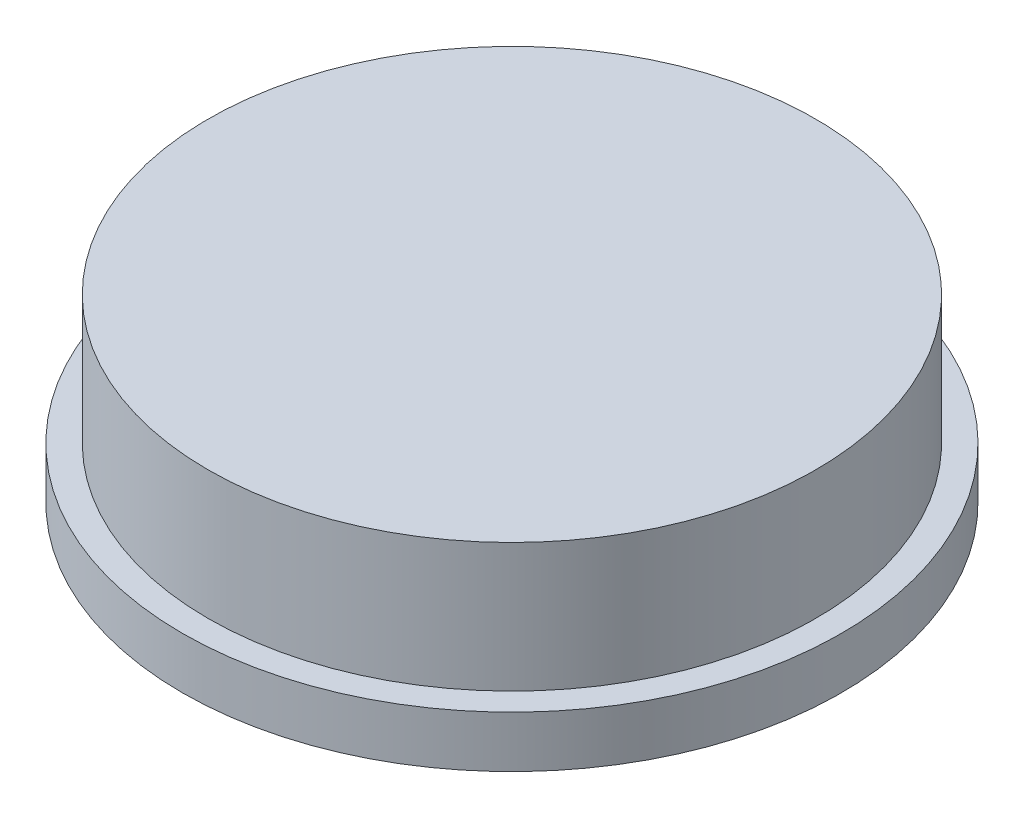
ISO-10303-21;
HEADER;
FILE_DESCRIPTION(('STEP AP214'),'2;1');
FILE_NAME('part.step','',(''),(''),'','','');
FILE_SCHEMA(('AUTOMOTIVE_DESIGN { 1 0 10303 214 1 1 1 1 }'));
ENDSEC;
DATA;
#1=APPLICATION_CONTEXT('core data for automotive mechanical design processes');
#2=APPLICATION_PROTOCOL_DEFINITION('international standard','automotive_design',2000,#1);
#3=PRODUCT_CONTEXT('',#1,'mechanical');
#4=PRODUCT('Part','Part','',(#3));
#5=PRODUCT_RELATED_PRODUCT_CATEGORY('part','',(#4));
#6=PRODUCT_DEFINITION_FORMATION('','',#4);
#7=PRODUCT_DEFINITION_CONTEXT('part definition',#1,'design');
#8=PRODUCT_DEFINITION('design','',#6,#7);
#9=PRODUCT_DEFINITION_SHAPE('','',#8);
#10=(LENGTH_UNIT() NAMED_UNIT(*) SI_UNIT(.MILLI.,.METRE.));
#11=(NAMED_UNIT(*) PLANE_ANGLE_UNIT() SI_UNIT($,.RADIAN.));
#12=(NAMED_UNIT(*) SI_UNIT($,.STERADIAN.) SOLID_ANGLE_UNIT());
#13=UNCERTAINTY_MEASURE_WITH_UNIT(LENGTH_MEASURE(1.E-05),#10,'distance_accuracy_value','');
#14=(GEOMETRIC_REPRESENTATION_CONTEXT(3) GLOBAL_UNCERTAINTY_ASSIGNED_CONTEXT((#13)) GLOBAL_UNIT_ASSIGNED_CONTEXT((#10,
#11,#12)) REPRESENTATION_CONTEXT('',''));
#15=CARTESIAN_POINT('',(0.,0.,0.));
#16=DIRECTION('',(0.,0.,1.));
#17=DIRECTION('',(1.,0.,0.));
#18=AXIS2_PLACEMENT_3D('',#15,#16,#17);
#19=CARTESIAN_POINT('',(0.,5.08,0.));
#20=DIRECTION('',(0.,-1.,0.));
#21=DIRECTION('',(0.,0.,-1.));
#22=AXIS2_PLACEMENT_3D('',#19,#20,#21);
#23=CYLINDRICAL_SURFACE('',#22,32.512);
#24=CARTESIAN_POINT('',(0.,5.08,0.));
#25=DIRECTION('',(0.,1.,0.));
#26=DIRECTION('',(0.,0.,1.));
#27=AXIS2_PLACEMENT_3D('',#24,#25,#26);
#28=CIRCLE('',#27,32.512);
#29=CARTESIAN_POINT('',(0.,5.08,32.512));
#30=VERTEX_POINT('',#29);
#31=EDGE_CURVE('E41',#30,#30,#28,.T.);
#32=ORIENTED_EDGE('',*,*,#31,.F.);
#33=EDGE_LOOP('',(#32));
#34=FACE_BOUND('',#33,.T.);
#35=CARTESIAN_POINT('',(0.,0.,0.));
#36=DIRECTION('',(0.,1.,0.));
#37=DIRECTION('',(0.,0.,1.));
#38=AXIS2_PLACEMENT_3D('',#35,#36,#37);
#39=CIRCLE('',#38,32.512);
#40=CARTESIAN_POINT('',(0.,0.,32.512));
#41=VERTEX_POINT('',#40);
#42=EDGE_CURVE('E37',#41,#41,#39,.T.);
#43=ORIENTED_EDGE('',*,*,#42,.T.);
#44=EDGE_LOOP('',(#43));
#45=FACE_BOUND('',#44,.T.);
#46=ADVANCED_FACE('F34',(#34,#45),#23,.T.);
#47=CARTESIAN_POINT('',(0.,5.08,0.));
#48=DIRECTION('',(0.,1.,0.));
#49=DIRECTION('',(0.,0.,1.));
#50=AXIS2_PLACEMENT_3D('',#47,#48,#49);
#51=PLANE('',#50);
#52=CARTESIAN_POINT('',(0.,5.08,0.));
#53=DIRECTION('',(0.,1.,0.));
#54=DIRECTION('',(0.,0.,1.));
#55=AXIS2_PLACEMENT_3D('',#52,#53,#54);
#56=CIRCLE('',#55,29.972);
#57=CARTESIAN_POINT('',(0.,5.08,29.972));
#58=VERTEX_POINT('',#57);
#59=EDGE_CURVE('E10',#58,#58,#56,.T.);
#60=ORIENTED_EDGE('',*,*,#59,.F.);
#61=EDGE_LOOP('',(#60));
#62=FACE_BOUND('',#61,.T.);
#63=ORIENTED_EDGE('',*,*,#31,.T.);
#64=EDGE_LOOP('',(#63));
#65=FACE_BOUND('',#64,.T.);
#66=ADVANCED_FACE('F58',(#62,#65),#51,.T.);
#67=CARTESIAN_POINT('',(0.,0.,0.));
#68=DIRECTION('',(0.,1.,0.));
#69=DIRECTION('',(0.,0.,1.));
#70=AXIS2_PLACEMENT_3D('',#67,#68,#69);
#71=PLANE('',#70);
#72=ORIENTED_EDGE('',*,*,#42,.F.);
#73=EDGE_LOOP('',(#72));
#74=FACE_BOUND('',#73,.T.);
#75=ADVANCED_FACE('F55',(#74),#71,.F.);
#76=CARTESIAN_POINT('',(0.,17.78,0.));
#77=DIRECTION('',(0.,-1.,0.));
#78=DIRECTION('',(0.,0.,-1.));
#79=AXIS2_PLACEMENT_3D('',#76,#77,#78);
#80=CYLINDRICAL_SURFACE('',#79,29.972);
#81=CARTESIAN_POINT('',(0.,17.78,0.));
#82=DIRECTION('',(0.,1.,0.));
#83=DIRECTION('',(0.,0.,1.));
#84=AXIS2_PLACEMENT_3D('',#81,#82,#83);
#85=CIRCLE('',#84,29.972);
#86=CARTESIAN_POINT('',(0.,17.78,29.972));
#87=VERTEX_POINT('',#86);
#88=EDGE_CURVE('E47',#87,#87,#85,.T.);
#89=ORIENTED_EDGE('',*,*,#88,.F.);
#90=EDGE_LOOP('',(#89));
#91=FACE_BOUND('',#90,.T.);
#92=ORIENTED_EDGE('',*,*,#59,.T.);
#93=EDGE_LOOP('',(#92));
#94=FACE_BOUND('',#93,.T.);
#95=ADVANCED_FACE('F57',(#91,#94),#80,.T.);
#96=CARTESIAN_POINT('',(0.,17.78,0.));
#97=DIRECTION('',(0.,1.,0.));
#98=DIRECTION('',(0.,0.,1.));
#99=AXIS2_PLACEMENT_3D('',#96,#97,#98);
#100=PLANE('',#99);
#101=ORIENTED_EDGE('',*,*,#88,.T.);
#102=EDGE_LOOP('',(#101));
#103=FACE_BOUND('',#102,.T.);
#104=ADVANCED_FACE('F63',(#103),#100,.T.);
#105=CLOSED_SHELL('',(#46,#66,#75,#95,#104));
#106=MANIFOLD_SOLID_BREP('B2',#105);
#107=ADVANCED_BREP_SHAPE_REPRESENTATION('',(#18,#106),#14);
#108=SHAPE_DEFINITION_REPRESENTATION(#9,#107);
ENDSEC;
END-ISO-10303-21;
